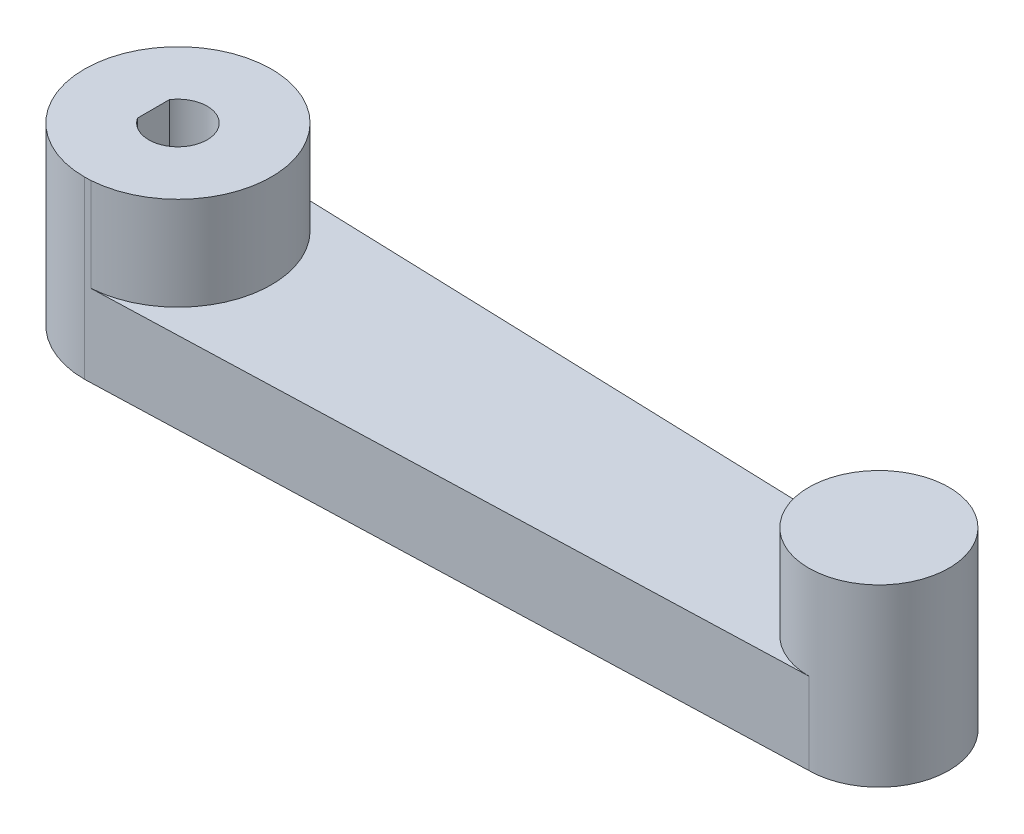
ISO-10303-21;
HEADER;
FILE_DESCRIPTION(('STEP AP214'),'2;1');
FILE_NAME('part.step','',(''),(''),'','','');
FILE_SCHEMA(('AUTOMOTIVE_DESIGN { 1 0 10303 214 1 1 1 1 }'));
ENDSEC;
DATA;
#1=APPLICATION_CONTEXT('core data for automotive mechanical design processes');
#2=APPLICATION_PROTOCOL_DEFINITION('international standard','automotive_design',2000,#1);
#3=PRODUCT_CONTEXT('',#1,'mechanical');
#4=PRODUCT('Part','Part','',(#3));
#5=PRODUCT_RELATED_PRODUCT_CATEGORY('part','',(#4));
#6=PRODUCT_DEFINITION_FORMATION('','',#4);
#7=PRODUCT_DEFINITION_CONTEXT('part definition',#1,'design');
#8=PRODUCT_DEFINITION('design','',#6,#7);
#9=PRODUCT_DEFINITION_SHAPE('','',#8);
#10=(LENGTH_UNIT() NAMED_UNIT(*) SI_UNIT(.MILLI.,.METRE.));
#11=(NAMED_UNIT(*) PLANE_ANGLE_UNIT() SI_UNIT($,.RADIAN.));
#12=(NAMED_UNIT(*) SI_UNIT($,.STERADIAN.) SOLID_ANGLE_UNIT());
#13=UNCERTAINTY_MEASURE_WITH_UNIT(LENGTH_MEASURE(1.E-05),#10,'distance_accuracy_value','');
#14=(GEOMETRIC_REPRESENTATION_CONTEXT(3) GLOBAL_UNCERTAINTY_ASSIGNED_CONTEXT((#13)) GLOBAL_UNIT_ASSIGNED_CONTEXT((#10,
#11,#12)) REPRESENTATION_CONTEXT('',''));
#15=CARTESIAN_POINT('',(0.,0.,0.));
#16=DIRECTION('',(0.,0.,1.));
#17=DIRECTION('',(1.,0.,0.));
#18=AXIS2_PLACEMENT_3D('',#15,#16,#17);
#19=CARTESIAN_POINT('',(0.,15.,0.));
#20=DIRECTION('',(0.,1.,0.));
#21=DIRECTION('',(0.,0.,1.));
#22=AXIS2_PLACEMENT_3D('',#19,#20,#21);
#23=PLANE('',#22);
#24=CARTESIAN_POINT('',(60.,15.,0.));
#25=DIRECTION('',(0.,1.,0.));
#26=DIRECTION('',(0.,0.,1.));
#27=AXIS2_PLACEMENT_3D('',#24,#25,#26);
#28=CIRCLE('',#27,6.);
#29=CARTESIAN_POINT('',(60.,15.,6.));
#30=VERTEX_POINT('',#29);
#31=EDGE_CURVE('E140',#30,#30,#28,.T.);
#32=ORIENTED_EDGE('',*,*,#31,.T.);
#33=EDGE_LOOP('',(#32));
#34=FACE_BOUND('',#33,.T.);
#35=ADVANCED_FACE('F36',(#34),#23,.T.);
#36=CARTESIAN_POINT('',(0.,15.,0.));
#37=DIRECTION('',(0.,1.,0.));
#38=DIRECTION('',(0.,0.,1.));
#39=AXIS2_PLACEMENT_3D('',#36,#37,#38);
#40=CIRCLE('',#39,2.5);
#41=CARTESIAN_POINT('',(-2.09678040782416,15.,1.36143744673224));
#42=VERTEX_POINT('',#41);
#43=CARTESIAN_POINT('',(-2.09678040782416,15.,-1.36143744673224));
#44=VERTEX_POINT('',#43);
#45=EDGE_CURVE('E58',#42,#44,#40,.T.);
#46=ORIENTED_EDGE('',*,*,#45,.F.);
#47=DIRECTION('',(0.,0.,1.));
#48=VECTOR('',#47,1.);
#49=CARTESIAN_POINT('',(-2.09678040782416,15.,-1.36143744673224));
#50=LINE('',#49,#48);
#51=EDGE_CURVE('E156',#44,#42,#50,.T.);
#52=ORIENTED_EDGE('',*,*,#51,.F.);
#53=EDGE_LOOP('',(#46,#52));
#54=FACE_BOUND('',#53,.T.);
#55=DIRECTION('',(0.999444906979154,0.,-0.0333148302326385));
#56=VECTOR('',#55,1.);
#57=CARTESIAN_POINT('',(0.,15.,8.));
#58=LINE('',#57,#56);
#59=CARTESIAN_POINT('',(0.,15.,8.));
#60=VERTEX_POINT('',#59);
#61=CARTESIAN_POINT('',(0.532741398446174,15.,7.98224195338513));
#62=VERTEX_POINT('',#61);
#63=EDGE_CURVE('E137',#60,#62,#58,.T.);
#64=ORIENTED_EDGE('',*,*,#63,.T.);
#65=CARTESIAN_POINT('',(0.,15.,0.));
#66=DIRECTION('',(0.,1.,0.));
#67=DIRECTION('',(0.,0.,1.));
#68=AXIS2_PLACEMENT_3D('',#65,#66,#67);
#69=CIRCLE('',#68,8.);
#70=CARTESIAN_POINT('',(0.532741398446174,15.,-7.98224195338513));
#71=VERTEX_POINT('',#70);
#72=EDGE_CURVE('E172',#62,#71,#69,.T.);
#73=ORIENTED_EDGE('',*,*,#72,.T.);
#74=DIRECTION('',(-0.999444906979154,0.,-0.0333148302326385));
#75=VECTOR('',#74,1.);
#76=CARTESIAN_POINT('',(0.,15.,-8.));
#77=LINE('',#76,#75);
#78=CARTESIAN_POINT('',(0.,15.,-8.));
#79=VERTEX_POINT('',#78);
#80=EDGE_CURVE('E119',#71,#79,#77,.T.);
#81=ORIENTED_EDGE('',*,*,#80,.T.);
#82=CARTESIAN_POINT('',(0.,15.,0.));
#83=DIRECTION('',(0.,1.,0.));
#84=DIRECTION('',(0.,0.,1.));
#85=AXIS2_PLACEMENT_3D('',#82,#83,#84);
#86=CIRCLE('',#85,8.);
#87=EDGE_CURVE('E121',#79,#60,#86,.T.);
#88=ORIENTED_EDGE('',*,*,#87,.T.);
#89=EDGE_LOOP('',(#64,#73,#81,#88));
#90=FACE_BOUND('',#89,.T.);
#91=ADVANCED_FACE('F167',(#54,#90),#23,.T.);
#92=CARTESIAN_POINT('',(0.,-75.7099729229908,8.));
#93=DIRECTION('',(0.0333148302326385,0.,0.999444906979154));
#94=DIRECTION('',(0.999444906979154,0.,-0.0333148302326385));
#95=AXIS2_PLACEMENT_3D('',#92,#93,#94);
#96=PLANE('',#95);
#97=DIRECTION('',(0.999444906979154,0.,-0.0333148302326385));
#98=VECTOR('',#97,1.);
#99=CARTESIAN_POINT('',(0.266370699223085,7.,7.99112097669256));
#100=LINE('',#99,#98);
#101=CARTESIAN_POINT('',(0.532741398446174,7.,7.98224195338513));
#102=VERTEX_POINT('',#101);
#103=CARTESIAN_POINT('',(60.,7.,6.));
#104=VERTEX_POINT('',#103);
#105=EDGE_CURVE('E108',#102,#104,#100,.T.);
#106=ORIENTED_EDGE('',*,*,#105,.F.);
#107=DIRECTION('',(0.,1.,0.));
#108=VECTOR('',#107,1.);
#109=CARTESIAN_POINT('',(0.532741398446174,7.,7.98224195338513));
#110=LINE('',#109,#108);
#111=EDGE_CURVE('E106',#102,#62,#110,.T.);
#112=ORIENTED_EDGE('',*,*,#111,.T.);
#113=ORIENTED_EDGE('',*,*,#63,.F.);
#114=DIRECTION('',(0.,1.,0.));
#115=VECTOR('',#114,1.);
#116=CARTESIAN_POINT('',(0.,-75.7099729229908,8.));
#117=LINE('',#116,#115);
#118=CARTESIAN_POINT('',(0.,0.,8.));
#119=VERTEX_POINT('',#118);
#120=EDGE_CURVE('E144',#119,#60,#117,.T.);
#121=ORIENTED_EDGE('',*,*,#120,.F.);
#122=DIRECTION('',(-0.999444906979154,0.,0.0333148302326385));
#123=VECTOR('',#122,1.);
#124=CARTESIAN_POINT('',(0.,0.,8.));
#125=LINE('',#124,#123);
#126=CARTESIAN_POINT('',(60.,0.,6.));
#127=VERTEX_POINT('',#126);
#128=EDGE_CURVE('E126',#127,#119,#125,.T.);
#129=ORIENTED_EDGE('',*,*,#128,.F.);
#130=DIRECTION('',(0.,1.,0.));
#131=VECTOR('',#130,1.);
#132=CARTESIAN_POINT('',(60.,-75.7099729229908,6.));
#133=LINE('',#132,#131);
#134=EDGE_CURVE('E148',#127,#104,#133,.T.);
#135=ORIENTED_EDGE('',*,*,#134,.T.);
#136=EDGE_LOOP('',(#106,#112,#113,#121,#129,#135));
#137=FACE_BOUND('',#136,.T.);
#138=ADVANCED_FACE('F170',(#137),#96,.T.);
#139=CARTESIAN_POINT('',(0.,-75.7099729229908,-8.));
#140=DIRECTION('',(0.0333148302326385,0.,-0.999444906979154));
#141=DIRECTION('',(-0.999444906979154,0.,-0.0333148302326385));
#142=AXIS2_PLACEMENT_3D('',#139,#140,#141);
#143=PLANE('',#142);
#144=ORIENTED_EDGE('',*,*,#80,.F.);
#145=DIRECTION('',(0.,1.,0.));
#146=VECTOR('',#145,1.);
#147=CARTESIAN_POINT('',(0.532741398446174,7.,-7.98224195338513));
#148=LINE('',#147,#146);
#149=CARTESIAN_POINT('',(0.532741398446174,7.,-7.98224195338513));
#150=VERTEX_POINT('',#149);
#151=EDGE_CURVE('E103',#150,#71,#148,.T.);
#152=ORIENTED_EDGE('',*,*,#151,.F.);
#153=DIRECTION('',(-0.999444906979154,0.,-0.0333148302326385));
#154=VECTOR('',#153,1.);
#155=CARTESIAN_POINT('',(0.266370699223085,7.,-7.99112097669256));
#156=LINE('',#155,#154);
#157=CARTESIAN_POINT('',(60.,7.00000000000001,-6.));
#158=VERTEX_POINT('',#157);
#159=EDGE_CURVE('E109',#158,#150,#156,.T.);
#160=ORIENTED_EDGE('',*,*,#159,.F.);
#161=DIRECTION('',(0.,1.,0.));
#162=VECTOR('',#161,1.);
#163=CARTESIAN_POINT('',(60.,-75.7099729229908,-6.));
#164=LINE('',#163,#162);
#165=CARTESIAN_POINT('',(60.,0.,-6.));
#166=VERTEX_POINT('',#165);
#167=EDGE_CURVE('E146',#166,#158,#164,.T.);
#168=ORIENTED_EDGE('',*,*,#167,.F.);
#169=DIRECTION('',(0.999444906979154,0.,0.0333148302326385));
#170=VECTOR('',#169,1.);
#171=CARTESIAN_POINT('',(0.,0.,-8.));
#172=LINE('',#171,#170);
#173=CARTESIAN_POINT('',(0.,0.,-8.));
#174=VERTEX_POINT('',#173);
#175=EDGE_CURVE('E131',#174,#166,#172,.T.);
#176=ORIENTED_EDGE('',*,*,#175,.F.);
#177=DIRECTION('',(0.,1.,0.));
#178=VECTOR('',#177,1.);
#179=CARTESIAN_POINT('',(0.,-75.7099729229908,-8.));
#180=LINE('',#179,#178);
#181=EDGE_CURVE('E132',#174,#79,#180,.T.);
#182=ORIENTED_EDGE('',*,*,#181,.T.);
#183=EDGE_LOOP('',(#144,#152,#160,#168,#176,#182));
#184=FACE_BOUND('',#183,.T.);
#185=ADVANCED_FACE('F117',(#184),#143,.T.);
#186=CARTESIAN_POINT('',(0.,0.,0.));
#187=DIRECTION('',(0.,1.,0.));
#188=DIRECTION('',(0.,0.,1.));
#189=AXIS2_PLACEMENT_3D('',#186,#187,#188);
#190=PLANE('',#189);
#191=DIRECTION('',(0.,0.,1.));
#192=VECTOR('',#191,1.);
#193=CARTESIAN_POINT('',(-2.09678040782416,0.,-1.36143744673224));
#194=LINE('',#193,#192);
#195=CARTESIAN_POINT('',(-2.09678040782416,0.,-1.36143744673224));
#196=VERTEX_POINT('',#195);
#197=CARTESIAN_POINT('',(-2.09678040782416,0.,1.36143744673224));
#198=VERTEX_POINT('',#197);
#199=EDGE_CURVE('E155',#196,#198,#194,.T.);
#200=ORIENTED_EDGE('',*,*,#199,.T.);
#201=CARTESIAN_POINT('',(0.,0.,0.));
#202=DIRECTION('',(0.,1.,0.));
#203=DIRECTION('',(0.,0.,1.));
#204=AXIS2_PLACEMENT_3D('',#201,#202,#203);
#205=CIRCLE('',#204,2.5);
#206=EDGE_CURVE('E152',#198,#196,#205,.T.);
#207=ORIENTED_EDGE('',*,*,#206,.T.);
#208=EDGE_LOOP('',(#200,#207));
#209=FACE_BOUND('',#208,.T.);
#210=CARTESIAN_POINT('',(0.,0.,0.));
#211=DIRECTION('',(0.,1.,0.));
#212=DIRECTION('',(0.,0.,1.));
#213=AXIS2_PLACEMENT_3D('',#210,#211,#212);
#214=CIRCLE('',#213,8.);
#215=EDGE_CURVE('E128',#119,#174,#214,.F.);
#216=ORIENTED_EDGE('',*,*,#215,.T.);
#217=ORIENTED_EDGE('',*,*,#175,.T.);
#218=CARTESIAN_POINT('',(60.,0.,0.));
#219=DIRECTION('',(0.,1.,0.));
#220=DIRECTION('',(0.,0.,1.));
#221=AXIS2_PLACEMENT_3D('',#218,#219,#220);
#222=CIRCLE('',#221,6.);
#223=EDGE_CURVE('E129',#166,#127,#222,.F.);
#224=ORIENTED_EDGE('',*,*,#223,.T.);
#225=ORIENTED_EDGE('',*,*,#128,.T.);
#226=EDGE_LOOP('',(#216,#217,#224,#225));
#227=FACE_BOUND('',#226,.T.);
#228=ADVANCED_FACE('F38',(#209,#227),#190,.F.);
#229=CARTESIAN_POINT('',(0.,0.,0.));
#230=DIRECTION('',(0.,1.,0.));
#231=DIRECTION('',(0.,0.,1.));
#232=AXIS2_PLACEMENT_3D('',#229,#230,#231);
#233=CYLINDRICAL_SURFACE('',#232,2.5);
#234=ORIENTED_EDGE('',*,*,#45,.T.);
#235=DIRECTION('',(0.,1.,0.));
#236=VECTOR('',#235,1.);
#237=CARTESIAN_POINT('',(-2.09678040782416,0.,-1.36143744673224));
#238=LINE('',#237,#236);
#239=EDGE_CURVE('E40',#196,#44,#238,.T.);
#240=ORIENTED_EDGE('',*,*,#239,.F.);
#241=ORIENTED_EDGE('',*,*,#206,.F.);
#242=DIRECTION('',(0.,1.,0.));
#243=VECTOR('',#242,1.);
#244=CARTESIAN_POINT('',(-2.09678040782416,0.,1.36143744673224));
#245=LINE('',#244,#243);
#246=EDGE_CURVE('E11',#198,#42,#245,.T.);
#247=ORIENTED_EDGE('',*,*,#246,.T.);
#248=EDGE_LOOP('',(#234,#240,#241,#247));
#249=FACE_BOUND('',#248,.T.);
#250=ADVANCED_FACE('F189',(#249),#233,.F.);
#251=CARTESIAN_POINT('',(-2.09678040782416,0.,-1.36143744673224));
#252=DIRECTION('',(-1.,0.,0.));
#253=DIRECTION('',(0.,0.,1.));
#254=AXIS2_PLACEMENT_3D('',#251,#252,#253);
#255=PLANE('',#254);
#256=ORIENTED_EDGE('',*,*,#51,.T.);
#257=ORIENTED_EDGE('',*,*,#246,.F.);
#258=ORIENTED_EDGE('',*,*,#199,.F.);
#259=ORIENTED_EDGE('',*,*,#239,.T.);
#260=EDGE_LOOP('',(#256,#257,#258,#259));
#261=FACE_BOUND('',#260,.T.);
#262=ADVANCED_FACE('F164',(#261),#255,.F.);
#263=CARTESIAN_POINT('',(60.,-75.7099729229908,0.));
#264=DIRECTION('',(0.,1.,0.));
#265=DIRECTION('',(0.,0.,1.));
#266=AXIS2_PLACEMENT_3D('',#263,#264,#265);
#267=CYLINDRICAL_SURFACE('',#266,6.);
#268=ORIENTED_EDGE('',*,*,#31,.F.);
#269=EDGE_LOOP('',(#268));
#270=FACE_BOUND('',#269,.T.);
#271=ORIENTED_EDGE('',*,*,#223,.F.);
#272=ORIENTED_EDGE('',*,*,#167,.T.);
#273=CARTESIAN_POINT('',(60.,7.,0.));
#274=DIRECTION('',(0.,1.,0.));
#275=DIRECTION('',(0.,0.,1.));
#276=AXIS2_PLACEMENT_3D('',#273,#274,#275);
#277=CIRCLE('',#276,6.);
#278=EDGE_CURVE('E51',#158,#104,#277,.T.);
#279=ORIENTED_EDGE('',*,*,#278,.T.);
#280=ORIENTED_EDGE('',*,*,#134,.F.);
#281=EDGE_LOOP('',(#271,#272,#279,#280));
#282=FACE_BOUND('',#281,.T.);
#283=ADVANCED_FACE('F180',(#270,#282),#267,.T.);
#284=CARTESIAN_POINT('',(0.,-75.7099729229908,0.));
#285=DIRECTION('',(0.,1.,0.));
#286=DIRECTION('',(0.,0.,1.));
#287=AXIS2_PLACEMENT_3D('',#284,#285,#286);
#288=CYLINDRICAL_SURFACE('',#287,8.);
#289=ORIENTED_EDGE('',*,*,#215,.F.);
#290=ORIENTED_EDGE('',*,*,#120,.T.);
#291=ORIENTED_EDGE('',*,*,#87,.F.);
#292=ORIENTED_EDGE('',*,*,#181,.F.);
#293=EDGE_LOOP('',(#289,#290,#291,#292));
#294=FACE_BOUND('',#293,.T.);
#295=ADVANCED_FACE('F187',(#294),#288,.T.);
#296=CARTESIAN_POINT('',(0.,7.,0.));
#297=DIRECTION('',(0.,1.,0.));
#298=DIRECTION('',(0.,0.,1.));
#299=AXIS2_PLACEMENT_3D('',#296,#297,#298);
#300=CYLINDRICAL_SURFACE('',#299,8.);
#301=ORIENTED_EDGE('',*,*,#72,.F.);
#302=ORIENTED_EDGE('',*,*,#111,.F.);
#303=CARTESIAN_POINT('',(0.,7.,0.));
#304=DIRECTION('',(0.,1.,0.));
#305=DIRECTION('',(0.,0.,1.));
#306=AXIS2_PLACEMENT_3D('',#303,#304,#305);
#307=CIRCLE('',#306,8.);
#308=EDGE_CURVE('E100',#102,#150,#307,.T.);
#309=ORIENTED_EDGE('',*,*,#308,.T.);
#310=ORIENTED_EDGE('',*,*,#151,.T.);
#311=EDGE_LOOP('',(#301,#302,#309,#310));
#312=FACE_BOUND('',#311,.T.);
#313=ADVANCED_FACE('F101',(#312),#300,.T.);
#314=CARTESIAN_POINT('',(0.,7.,0.));
#315=DIRECTION('',(0.,1.,0.));
#316=DIRECTION('',(0.,0.,1.));
#317=AXIS2_PLACEMENT_3D('',#314,#315,#316);
#318=PLANE('',#317);
#319=ORIENTED_EDGE('',*,*,#278,.F.);
#320=ORIENTED_EDGE('',*,*,#159,.T.);
#321=ORIENTED_EDGE('',*,*,#308,.F.);
#322=ORIENTED_EDGE('',*,*,#105,.T.);
#323=EDGE_LOOP('',(#319,#320,#321,#322));
#324=FACE_BOUND('',#323,.T.);
#325=ADVANCED_FACE('F111',(#324),#318,.T.);
#326=CLOSED_SHELL('',(#35,#91,#138,#185,#228,#250,#262,#283,#295,#313,#325));
#327=MANIFOLD_SOLID_BREP('B2',#326);
#328=ADVANCED_BREP_SHAPE_REPRESENTATION('',(#18,#327),#14);
#329=SHAPE_DEFINITION_REPRESENTATION(#9,#328);
ENDSEC;
END-ISO-10303-21;
